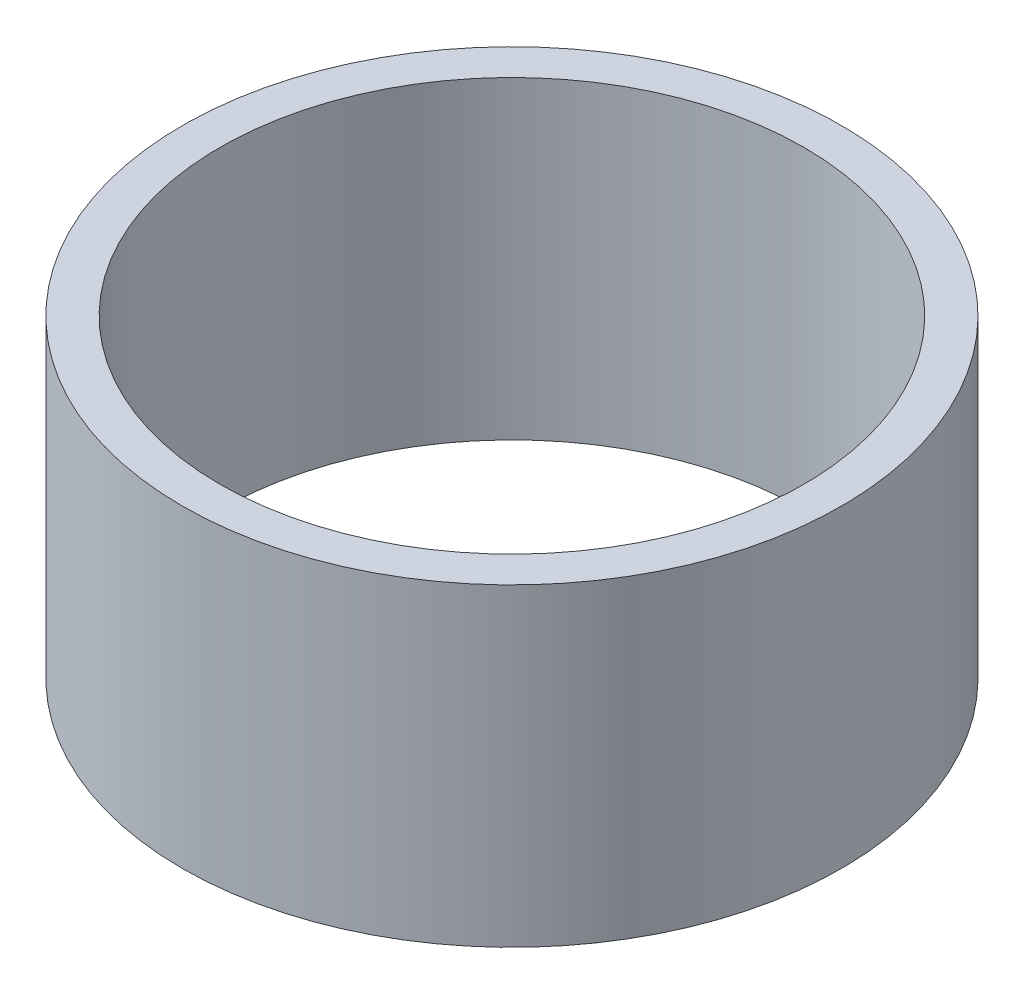
ISO-10303-21;
HEADER;
FILE_DESCRIPTION(('STEP AP214'),'2;1');
FILE_NAME('part.step','',(''),(''),'','','');
FILE_SCHEMA(('AUTOMOTIVE_DESIGN { 1 0 10303 214 1 1 1 1 }'));
ENDSEC;
DATA;
#1=APPLICATION_CONTEXT('core data for automotive mechanical design processes');
#2=APPLICATION_PROTOCOL_DEFINITION('international standard','automotive_design',2000,#1);
#3=PRODUCT_CONTEXT('',#1,'mechanical');
#4=PRODUCT('Part','Part','',(#3));
#5=PRODUCT_RELATED_PRODUCT_CATEGORY('part','',(#4));
#6=PRODUCT_DEFINITION_FORMATION('','',#4);
#7=PRODUCT_DEFINITION_CONTEXT('part definition',#1,'design');
#8=PRODUCT_DEFINITION('design','',#6,#7);
#9=PRODUCT_DEFINITION_SHAPE('','',#8);
#10=(LENGTH_UNIT() NAMED_UNIT(*) SI_UNIT(.MILLI.,.METRE.));
#11=(NAMED_UNIT(*) PLANE_ANGLE_UNIT() SI_UNIT($,.RADIAN.));
#12=(NAMED_UNIT(*) SI_UNIT($,.STERADIAN.) SOLID_ANGLE_UNIT());
#13=UNCERTAINTY_MEASURE_WITH_UNIT(LENGTH_MEASURE(1.E-05),#10,'distance_accuracy_value','');
#14=(GEOMETRIC_REPRESENTATION_CONTEXT(3) GLOBAL_UNCERTAINTY_ASSIGNED_CONTEXT((#13)) GLOBAL_UNIT_ASSIGNED_CONTEXT((#10,
#11,#12)) REPRESENTATION_CONTEXT('',''));
#15=CARTESIAN_POINT('',(0.,0.,0.));
#16=DIRECTION('',(0.,0.,1.));
#17=DIRECTION('',(1.,0.,0.));
#18=AXIS2_PLACEMENT_3D('',#15,#16,#17);
#19=CARTESIAN_POINT('',(0.,50.,0.));
#20=DIRECTION('',(0.,1.,0.));
#21=DIRECTION('',(0.,0.,1.));
#22=AXIS2_PLACEMENT_3D('',#19,#20,#21);
#23=PLANE('',#22);
#24=CARTESIAN_POINT('',(0.,50.,0.));
#25=DIRECTION('',(0.,1.,0.));
#26=DIRECTION('',(0.,0.,1.));
#27=AXIS2_PLACEMENT_3D('',#24,#25,#26);
#28=CIRCLE('',#27,52.5);
#29=CARTESIAN_POINT('',(0.,50.,52.5));
#30=VERTEX_POINT('',#29);
#31=EDGE_CURVE('E10',#30,#30,#28,.T.);
#32=ORIENTED_EDGE('',*,*,#31,.T.);
#33=EDGE_LOOP('',(#32));
#34=FACE_BOUND('',#33,.T.);
#35=CARTESIAN_POINT('',(0.,50.,0.));
#36=DIRECTION('',(0.,1.,0.));
#37=DIRECTION('',(0.,0.,1.));
#38=AXIS2_PLACEMENT_3D('',#35,#36,#37);
#39=CIRCLE('',#38,46.5);
#40=CARTESIAN_POINT('',(0.,50.,46.5));
#41=VERTEX_POINT('',#40);
#42=EDGE_CURVE('E42',#41,#41,#39,.T.);
#43=ORIENTED_EDGE('',*,*,#42,.F.);
#44=EDGE_LOOP('',(#43));
#45=FACE_BOUND('',#44,.T.);
#46=ADVANCED_FACE('F31',(#34,#45),#23,.T.);
#47=CARTESIAN_POINT('',(0.,0.,0.));
#48=DIRECTION('',(0.,1.,0.));
#49=DIRECTION('',(0.,0.,1.));
#50=AXIS2_PLACEMENT_3D('',#47,#48,#49);
#51=PLANE('',#50);
#52=CARTESIAN_POINT('',(0.,0.,0.));
#53=DIRECTION('',(0.,1.,0.));
#54=DIRECTION('',(0.,0.,1.));
#55=AXIS2_PLACEMENT_3D('',#52,#53,#54);
#56=CIRCLE('',#55,52.5);
#57=CARTESIAN_POINT('',(0.,0.,52.5));
#58=VERTEX_POINT('',#57);
#59=EDGE_CURVE('E35',#58,#58,#56,.T.);
#60=ORIENTED_EDGE('',*,*,#59,.F.);
#61=EDGE_LOOP('',(#60));
#62=FACE_BOUND('',#61,.T.);
#63=CARTESIAN_POINT('',(0.,0.,0.));
#64=DIRECTION('',(0.,1.,0.));
#65=DIRECTION('',(0.,0.,1.));
#66=AXIS2_PLACEMENT_3D('',#63,#64,#65);
#67=CIRCLE('',#66,46.5);
#68=CARTESIAN_POINT('',(0.,0.,46.5));
#69=VERTEX_POINT('',#68);
#70=EDGE_CURVE('E44',#69,#69,#67,.T.);
#71=ORIENTED_EDGE('',*,*,#70,.T.);
#72=EDGE_LOOP('',(#71));
#73=FACE_BOUND('',#72,.T.);
#74=ADVANCED_FACE('F54',(#62,#73),#51,.F.);
#75=CARTESIAN_POINT('',(0.,50.,0.));
#76=DIRECTION('',(0.,-1.,0.));
#77=DIRECTION('',(0.,0.,-1.));
#78=AXIS2_PLACEMENT_3D('',#75,#76,#77);
#79=CYLINDRICAL_SURFACE('',#78,52.5);
#80=ORIENTED_EDGE('',*,*,#31,.F.);
#81=EDGE_LOOP('',(#80));
#82=FACE_BOUND('',#81,.T.);
#83=ORIENTED_EDGE('',*,*,#59,.T.);
#84=EDGE_LOOP('',(#83));
#85=FACE_BOUND('',#84,.T.);
#86=ADVANCED_FACE('F33',(#82,#85),#79,.T.);
#87=CARTESIAN_POINT('',(0.,50.,0.));
#88=DIRECTION('',(0.,-1.,0.));
#89=DIRECTION('',(0.,0.,-1.));
#90=AXIS2_PLACEMENT_3D('',#87,#88,#89);
#91=CYLINDRICAL_SURFACE('',#90,46.5);
#92=ORIENTED_EDGE('',*,*,#42,.T.);
#93=EDGE_LOOP('',(#92));
#94=FACE_BOUND('',#93,.T.);
#95=ORIENTED_EDGE('',*,*,#70,.F.);
#96=EDGE_LOOP('',(#95));
#97=FACE_BOUND('',#96,.T.);
#98=ADVANCED_FACE('F50',(#94,#97),#91,.F.);
#99=CLOSED_SHELL('',(#46,#74,#86,#98));
#100=MANIFOLD_SOLID_BREP('B2',#99);
#101=ADVANCED_BREP_SHAPE_REPRESENTATION('',(#18,#100),#14);
#102=SHAPE_DEFINITION_REPRESENTATION(#9,#101);
ENDSEC;
END-ISO-10303-21;
